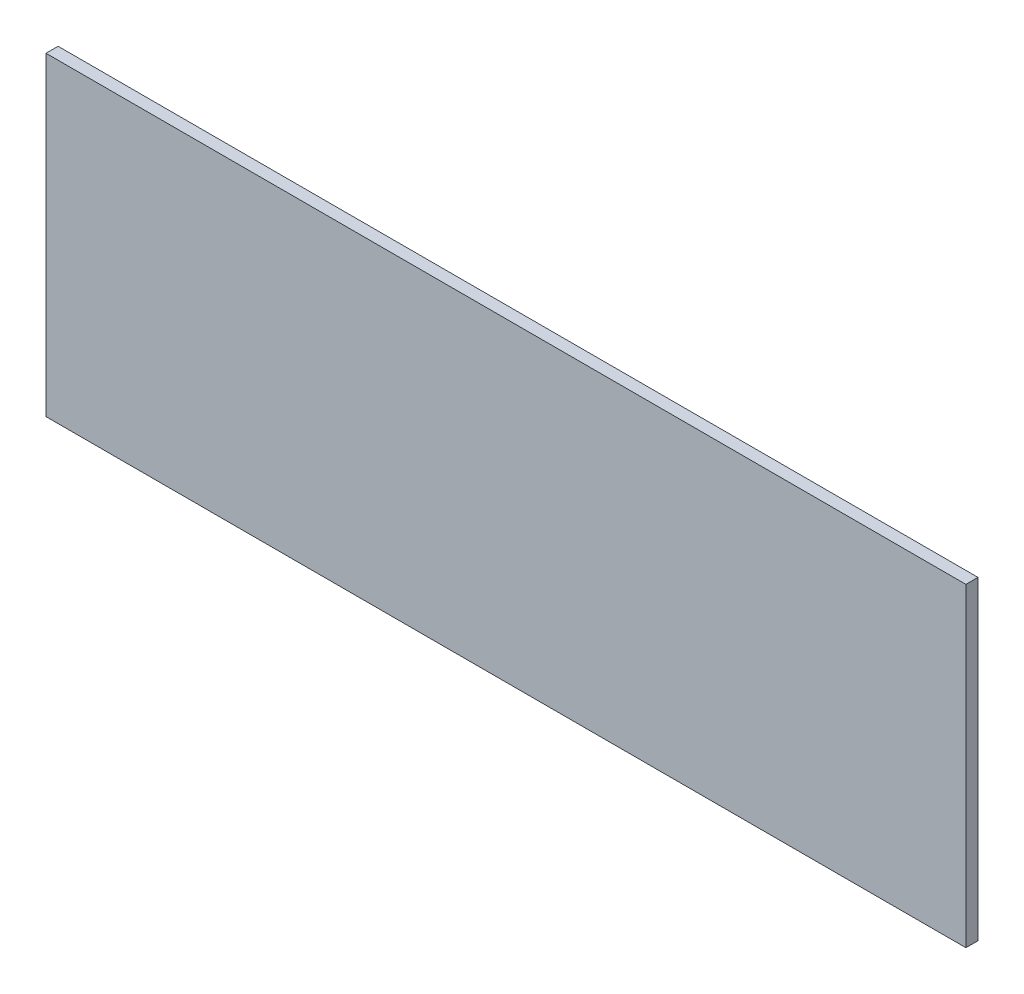
ISO-10303-21;
HEADER;
FILE_DESCRIPTION(('STEP AP214'),'2;1');
FILE_NAME('part.step','',(''),(''),'','','');
FILE_SCHEMA(('AUTOMOTIVE_DESIGN { 1 0 10303 214 1 1 1 1 }'));
ENDSEC;
DATA;
#1=APPLICATION_CONTEXT('core data for automotive mechanical design processes');
#2=APPLICATION_PROTOCOL_DEFINITION('international standard','automotive_design',2000,#1);
#3=PRODUCT_CONTEXT('',#1,'mechanical');
#4=PRODUCT('Part','Part','',(#3));
#5=PRODUCT_RELATED_PRODUCT_CATEGORY('part','',(#4));
#6=PRODUCT_DEFINITION_FORMATION('','',#4);
#7=PRODUCT_DEFINITION_CONTEXT('part definition',#1,'design');
#8=PRODUCT_DEFINITION('design','',#6,#7);
#9=PRODUCT_DEFINITION_SHAPE('','',#8);
#10=(LENGTH_UNIT() NAMED_UNIT(*) SI_UNIT(.MILLI.,.METRE.));
#11=(NAMED_UNIT(*) PLANE_ANGLE_UNIT() SI_UNIT($,.RADIAN.));
#12=(NAMED_UNIT(*) SI_UNIT($,.STERADIAN.) SOLID_ANGLE_UNIT());
#13=UNCERTAINTY_MEASURE_WITH_UNIT(LENGTH_MEASURE(1.E-05),#10,'distance_accuracy_value','');
#14=(GEOMETRIC_REPRESENTATION_CONTEXT(3) GLOBAL_UNCERTAINTY_ASSIGNED_CONTEXT((#13)) GLOBAL_UNIT_ASSIGNED_CONTEXT((#10,
#11,#12)) REPRESENTATION_CONTEXT('',''));
#15=CARTESIAN_POINT('',(0.,0.,0.));
#16=DIRECTION('',(0.,0.,1.));
#17=DIRECTION('',(1.,0.,0.));
#18=AXIS2_PLACEMENT_3D('',#15,#16,#17);
#19=CARTESIAN_POINT('',(0.,0.,1.));
#20=DIRECTION('',(1.,0.,0.));
#21=DIRECTION('',(0.,0.,-1.));
#22=AXIS2_PLACEMENT_3D('',#19,#20,#21);
#23=PLANE('',#22);
#24=DIRECTION('',(0.,-1.,0.));
#25=VECTOR('',#24,1.);
#26=CARTESIAN_POINT('',(0.,0.,0.));
#27=LINE('',#26,#25);
#28=CARTESIAN_POINT('',(0.,26.,0.));
#29=VERTEX_POINT('',#28);
#30=CARTESIAN_POINT('',(0.,0.,0.));
#31=VERTEX_POINT('',#30);
#32=EDGE_CURVE('E106',#29,#31,#27,.T.);
#33=ORIENTED_EDGE('',*,*,#32,.T.);
#34=DIRECTION('',(0.,0.,-1.));
#35=VECTOR('',#34,1.);
#36=CARTESIAN_POINT('',(0.,0.,1.));
#37=LINE('',#36,#35);
#38=CARTESIAN_POINT('',(0.,0.,1.));
#39=VERTEX_POINT('',#38);
#40=EDGE_CURVE('E11',#39,#31,#37,.T.);
#41=ORIENTED_EDGE('',*,*,#40,.F.);
#42=DIRECTION('',(0.,-1.,0.));
#43=VECTOR('',#42,1.);
#44=CARTESIAN_POINT('',(0.,0.,1.));
#45=LINE('',#44,#43);
#46=CARTESIAN_POINT('',(0.,26.,1.));
#47=VERTEX_POINT('',#46);
#48=EDGE_CURVE('E94',#47,#39,#45,.T.);
#49=ORIENTED_EDGE('',*,*,#48,.F.);
#50=DIRECTION('',(0.,0.,-1.));
#51=VECTOR('',#50,1.);
#52=CARTESIAN_POINT('',(0.,26.,1.));
#53=LINE('',#52,#51);
#54=EDGE_CURVE('E102',#47,#29,#53,.T.);
#55=ORIENTED_EDGE('',*,*,#54,.T.);
#56=EDGE_LOOP('',(#33,#41,#49,#55));
#57=FACE_BOUND('',#56,.T.);
#58=ADVANCED_FACE('F43',(#57),#23,.F.);
#59=CARTESIAN_POINT('',(0.,0.,1.));
#60=DIRECTION('',(0.,1.,0.));
#61=DIRECTION('',(0.,0.,1.));
#62=AXIS2_PLACEMENT_3D('',#59,#60,#61);
#63=PLANE('',#62);
#64=DIRECTION('',(1.,0.,0.));
#65=VECTOR('',#64,1.);
#66=CARTESIAN_POINT('',(0.,0.,0.));
#67=LINE('',#66,#65);
#68=CARTESIAN_POINT('',(76.,0.,0.));
#69=VERTEX_POINT('',#68);
#70=EDGE_CURVE('E98',#31,#69,#67,.T.);
#71=ORIENTED_EDGE('',*,*,#70,.T.);
#72=DIRECTION('',(0.,0.,-1.));
#73=VECTOR('',#72,1.);
#74=CARTESIAN_POINT('',(76.,0.,1.));
#75=LINE('',#74,#73);
#76=CARTESIAN_POINT('',(76.,0.,1.));
#77=VERTEX_POINT('',#76);
#78=EDGE_CURVE('E51',#77,#69,#75,.T.);
#79=ORIENTED_EDGE('',*,*,#78,.F.);
#80=DIRECTION('',(1.,0.,0.));
#81=VECTOR('',#80,1.);
#82=CARTESIAN_POINT('',(0.,0.,1.));
#83=LINE('',#82,#81);
#84=EDGE_CURVE('E89',#39,#77,#83,.T.);
#85=ORIENTED_EDGE('',*,*,#84,.F.);
#86=ORIENTED_EDGE('',*,*,#40,.T.);
#87=EDGE_LOOP('',(#71,#79,#85,#86));
#88=FACE_BOUND('',#87,.T.);
#89=ADVANCED_FACE('F97',(#88),#63,.F.);
#90=CARTESIAN_POINT('',(76.,0.,1.));
#91=DIRECTION('',(-1.,0.,0.));
#92=DIRECTION('',(0.,0.,1.));
#93=AXIS2_PLACEMENT_3D('',#90,#91,#92);
#94=PLANE('',#93);
#95=DIRECTION('',(0.,1.,0.));
#96=VECTOR('',#95,1.);
#97=CARTESIAN_POINT('',(76.,0.,0.));
#98=LINE('',#97,#96);
#99=CARTESIAN_POINT('',(76.,26.,0.));
#100=VERTEX_POINT('',#99);
#101=EDGE_CURVE('E76',#69,#100,#98,.T.);
#102=ORIENTED_EDGE('',*,*,#101,.T.);
#103=DIRECTION('',(0.,0.,-1.));
#104=VECTOR('',#103,1.);
#105=CARTESIAN_POINT('',(76.,26.,1.));
#106=LINE('',#105,#104);
#107=CARTESIAN_POINT('',(76.,26.,1.));
#108=VERTEX_POINT('',#107);
#109=EDGE_CURVE('E99',#108,#100,#106,.T.);
#110=ORIENTED_EDGE('',*,*,#109,.F.);
#111=DIRECTION('',(0.,1.,0.));
#112=VECTOR('',#111,1.);
#113=CARTESIAN_POINT('',(76.,0.,1.));
#114=LINE('',#113,#112);
#115=EDGE_CURVE('E92',#77,#108,#114,.T.);
#116=ORIENTED_EDGE('',*,*,#115,.F.);
#117=ORIENTED_EDGE('',*,*,#78,.T.);
#118=EDGE_LOOP('',(#102,#110,#116,#117));
#119=FACE_BOUND('',#118,.T.);
#120=ADVANCED_FACE('F100',(#119),#94,.F.);
#121=CARTESIAN_POINT('',(0.,26.,1.));
#122=DIRECTION('',(0.,-1.,0.));
#123=DIRECTION('',(0.,0.,-1.));
#124=AXIS2_PLACEMENT_3D('',#121,#122,#123);
#125=PLANE('',#124);
#126=DIRECTION('',(-1.,0.,0.));
#127=VECTOR('',#126,1.);
#128=CARTESIAN_POINT('',(0.,26.,0.));
#129=LINE('',#128,#127);
#130=EDGE_CURVE('E82',#100,#29,#129,.T.);
#131=ORIENTED_EDGE('',*,*,#130,.T.);
#132=ORIENTED_EDGE('',*,*,#54,.F.);
#133=DIRECTION('',(-1.,0.,0.));
#134=VECTOR('',#133,1.);
#135=CARTESIAN_POINT('',(0.,26.,1.));
#136=LINE('',#135,#134);
#137=EDGE_CURVE('E59',#108,#47,#136,.T.);
#138=ORIENTED_EDGE('',*,*,#137,.F.);
#139=ORIENTED_EDGE('',*,*,#109,.T.);
#140=EDGE_LOOP('',(#131,#132,#138,#139));
#141=FACE_BOUND('',#140,.T.);
#142=ADVANCED_FACE('F113',(#141),#125,.F.);
#143=CARTESIAN_POINT('',(0.,0.,1.));
#144=DIRECTION('',(0.,0.,-1.));
#145=DIRECTION('',(-1.,0.,0.));
#146=AXIS2_PLACEMENT_3D('',#143,#144,#145);
#147=PLANE('',#146);
#148=ORIENTED_EDGE('',*,*,#48,.T.);
#149=ORIENTED_EDGE('',*,*,#84,.T.);
#150=ORIENTED_EDGE('',*,*,#115,.T.);
#151=ORIENTED_EDGE('',*,*,#137,.T.);
#152=EDGE_LOOP('',(#148,#149,#150,#151));
#153=FACE_BOUND('',#152,.T.);
#154=ADVANCED_FACE('F90',(#153),#147,.F.);
#155=CARTESIAN_POINT('',(0.,0.,0.));
#156=DIRECTION('',(0.,0.,-1.));
#157=DIRECTION('',(-1.,0.,0.));
#158=AXIS2_PLACEMENT_3D('',#155,#156,#157);
#159=PLANE('',#158);
#160=ORIENTED_EDGE('',*,*,#32,.F.);
#161=ORIENTED_EDGE('',*,*,#130,.F.);
#162=ORIENTED_EDGE('',*,*,#101,.F.);
#163=ORIENTED_EDGE('',*,*,#70,.F.);
#164=EDGE_LOOP('',(#160,#161,#162,#163));
#165=FACE_BOUND('',#164,.T.);
#166=ADVANCED_FACE('F116',(#165),#159,.T.);
#167=CLOSED_SHELL('',(#58,#89,#120,#142,#154,#166));
#168=MANIFOLD_SOLID_BREP('B2',#167);
#169=ADVANCED_BREP_SHAPE_REPRESENTATION('',(#18,#168),#14);
#170=SHAPE_DEFINITION_REPRESENTATION(#9,#169);
ENDSEC;
END-ISO-10303-21;
